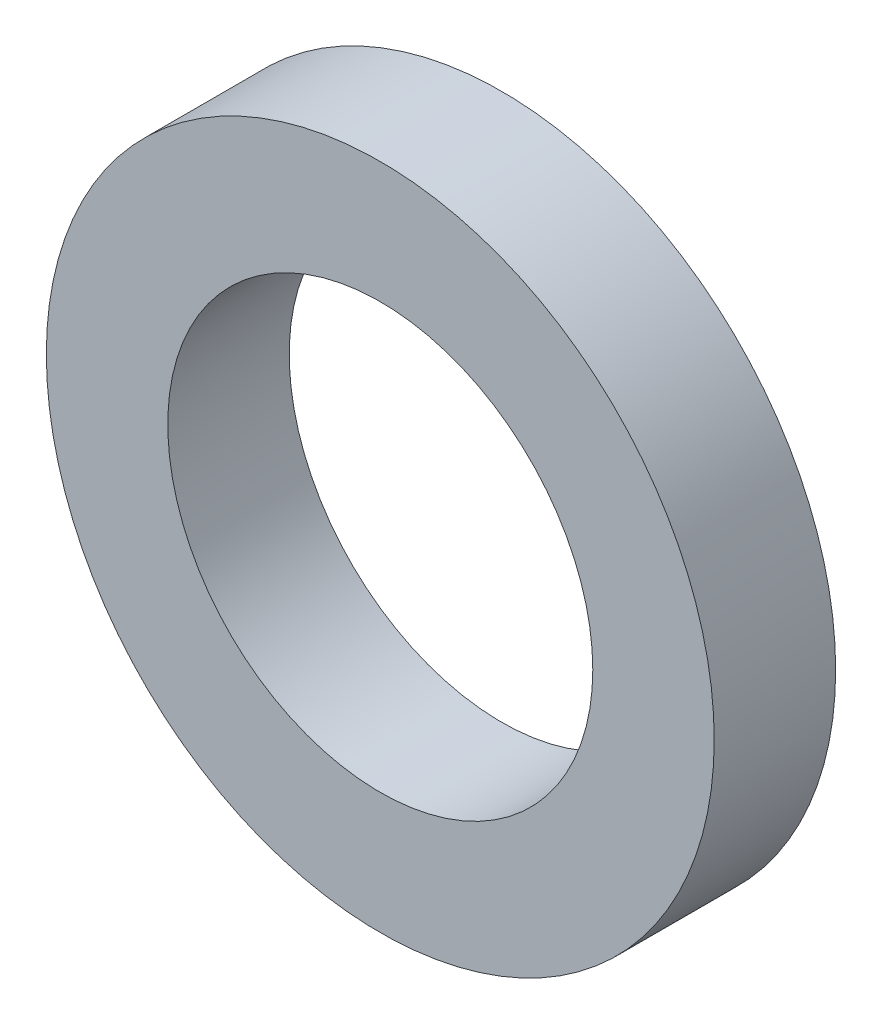
ISO-10303-21;
HEADER;
FILE_DESCRIPTION(('STEP AP214'),'2;1');
FILE_NAME('part.step','',(''),(''),'','','');
FILE_SCHEMA(('AUTOMOTIVE_DESIGN { 1 0 10303 214 1 1 1 1 }'));
ENDSEC;
DATA;
#1=APPLICATION_CONTEXT('core data for automotive mechanical design processes');
#2=APPLICATION_PROTOCOL_DEFINITION('international standard','automotive_design',2000,#1);
#3=PRODUCT_CONTEXT('',#1,'mechanical');
#4=PRODUCT('Part','Part','',(#3));
#5=PRODUCT_RELATED_PRODUCT_CATEGORY('part','',(#4));
#6=PRODUCT_DEFINITION_FORMATION('','',#4);
#7=PRODUCT_DEFINITION_CONTEXT('part definition',#1,'design');
#8=PRODUCT_DEFINITION('design','',#6,#7);
#9=PRODUCT_DEFINITION_SHAPE('','',#8);
#10=(LENGTH_UNIT() NAMED_UNIT(*) SI_UNIT(.MILLI.,.METRE.));
#11=(NAMED_UNIT(*) PLANE_ANGLE_UNIT() SI_UNIT($,.RADIAN.));
#12=(NAMED_UNIT(*) SI_UNIT($,.STERADIAN.) SOLID_ANGLE_UNIT());
#13=UNCERTAINTY_MEASURE_WITH_UNIT(LENGTH_MEASURE(1.E-05),#10,'distance_accuracy_value','');
#14=(GEOMETRIC_REPRESENTATION_CONTEXT(3) GLOBAL_UNCERTAINTY_ASSIGNED_CONTEXT((#13)) GLOBAL_UNIT_ASSIGNED_CONTEXT((#10,
#11,#12)) REPRESENTATION_CONTEXT('',''));
#15=CARTESIAN_POINT('',(0.,0.,0.));
#16=DIRECTION('',(0.,0.,1.));
#17=DIRECTION('',(1.,0.,0.));
#18=AXIS2_PLACEMENT_3D('',#15,#16,#17);
#19=CARTESIAN_POINT('',(0.,0.,2.));
#20=DIRECTION('',(0.,0.,1.));
#21=DIRECTION('',(1.,0.,0.));
#22=AXIS2_PLACEMENT_3D('',#19,#20,#21);
#23=PLANE('',#22);
#24=CARTESIAN_POINT('',(0.,0.,2.));
#25=DIRECTION('',(0.,0.,1.));
#26=DIRECTION('',(1.,0.,0.));
#27=AXIS2_PLACEMENT_3D('',#24,#25,#26);
#28=CIRCLE('',#27,5.5);
#29=CARTESIAN_POINT('',(5.5,0.,2.));
#30=VERTEX_POINT('',#29);
#31=EDGE_CURVE('E10',#30,#30,#28,.T.);
#32=ORIENTED_EDGE('',*,*,#31,.T.);
#33=EDGE_LOOP('',(#32));
#34=FACE_BOUND('',#33,.T.);
#35=CARTESIAN_POINT('',(0.,0.,2.));
#36=DIRECTION('',(0.,0.,1.));
#37=DIRECTION('',(1.,0.,0.));
#38=AXIS2_PLACEMENT_3D('',#35,#36,#37);
#39=CIRCLE('',#38,3.5);
#40=CARTESIAN_POINT('',(3.5,0.,2.));
#41=VERTEX_POINT('',#40);
#42=EDGE_CURVE('E42',#41,#41,#39,.T.);
#43=ORIENTED_EDGE('',*,*,#42,.F.);
#44=EDGE_LOOP('',(#43));
#45=FACE_BOUND('',#44,.T.);
#46=ADVANCED_FACE('F31',(#34,#45),#23,.T.);
#47=CARTESIAN_POINT('',(0.,0.,0.));
#48=DIRECTION('',(0.,0.,1.));
#49=DIRECTION('',(1.,0.,0.));
#50=AXIS2_PLACEMENT_3D('',#47,#48,#49);
#51=PLANE('',#50);
#52=CARTESIAN_POINT('',(0.,0.,0.));
#53=DIRECTION('',(0.,0.,1.));
#54=DIRECTION('',(1.,0.,0.));
#55=AXIS2_PLACEMENT_3D('',#52,#53,#54);
#56=CIRCLE('',#55,5.5);
#57=CARTESIAN_POINT('',(5.5,0.,0.));
#58=VERTEX_POINT('',#57);
#59=EDGE_CURVE('E35',#58,#58,#56,.T.);
#60=ORIENTED_EDGE('',*,*,#59,.F.);
#61=EDGE_LOOP('',(#60));
#62=FACE_BOUND('',#61,.T.);
#63=CARTESIAN_POINT('',(0.,0.,0.));
#64=DIRECTION('',(0.,0.,1.));
#65=DIRECTION('',(1.,0.,0.));
#66=AXIS2_PLACEMENT_3D('',#63,#64,#65);
#67=CIRCLE('',#66,3.5);
#68=CARTESIAN_POINT('',(3.5,0.,0.));
#69=VERTEX_POINT('',#68);
#70=EDGE_CURVE('E44',#69,#69,#67,.T.);
#71=ORIENTED_EDGE('',*,*,#70,.T.);
#72=EDGE_LOOP('',(#71));
#73=FACE_BOUND('',#72,.T.);
#74=ADVANCED_FACE('F54',(#62,#73),#51,.F.);
#75=CARTESIAN_POINT('',(0.,0.,2.));
#76=DIRECTION('',(0.,0.,-1.));
#77=DIRECTION('',(-1.,0.,0.));
#78=AXIS2_PLACEMENT_3D('',#75,#76,#77);
#79=CYLINDRICAL_SURFACE('',#78,5.5);
#80=ORIENTED_EDGE('',*,*,#31,.F.);
#81=EDGE_LOOP('',(#80));
#82=FACE_BOUND('',#81,.T.);
#83=ORIENTED_EDGE('',*,*,#59,.T.);
#84=EDGE_LOOP('',(#83));
#85=FACE_BOUND('',#84,.T.);
#86=ADVANCED_FACE('F33',(#82,#85),#79,.T.);
#87=CARTESIAN_POINT('',(0.,0.,2.));
#88=DIRECTION('',(0.,0.,-1.));
#89=DIRECTION('',(-1.,0.,0.));
#90=AXIS2_PLACEMENT_3D('',#87,#88,#89);
#91=CYLINDRICAL_SURFACE('',#90,3.5);
#92=ORIENTED_EDGE('',*,*,#42,.T.);
#93=EDGE_LOOP('',(#92));
#94=FACE_BOUND('',#93,.T.);
#95=ORIENTED_EDGE('',*,*,#70,.F.);
#96=EDGE_LOOP('',(#95));
#97=FACE_BOUND('',#96,.T.);
#98=ADVANCED_FACE('F50',(#94,#97),#91,.F.);
#99=CLOSED_SHELL('',(#46,#74,#86,#98));
#100=MANIFOLD_SOLID_BREP('B2',#99);
#101=ADVANCED_BREP_SHAPE_REPRESENTATION('',(#18,#100),#14);
#102=SHAPE_DEFINITION_REPRESENTATION(#9,#101);
ENDSEC;
END-ISO-10303-21;
